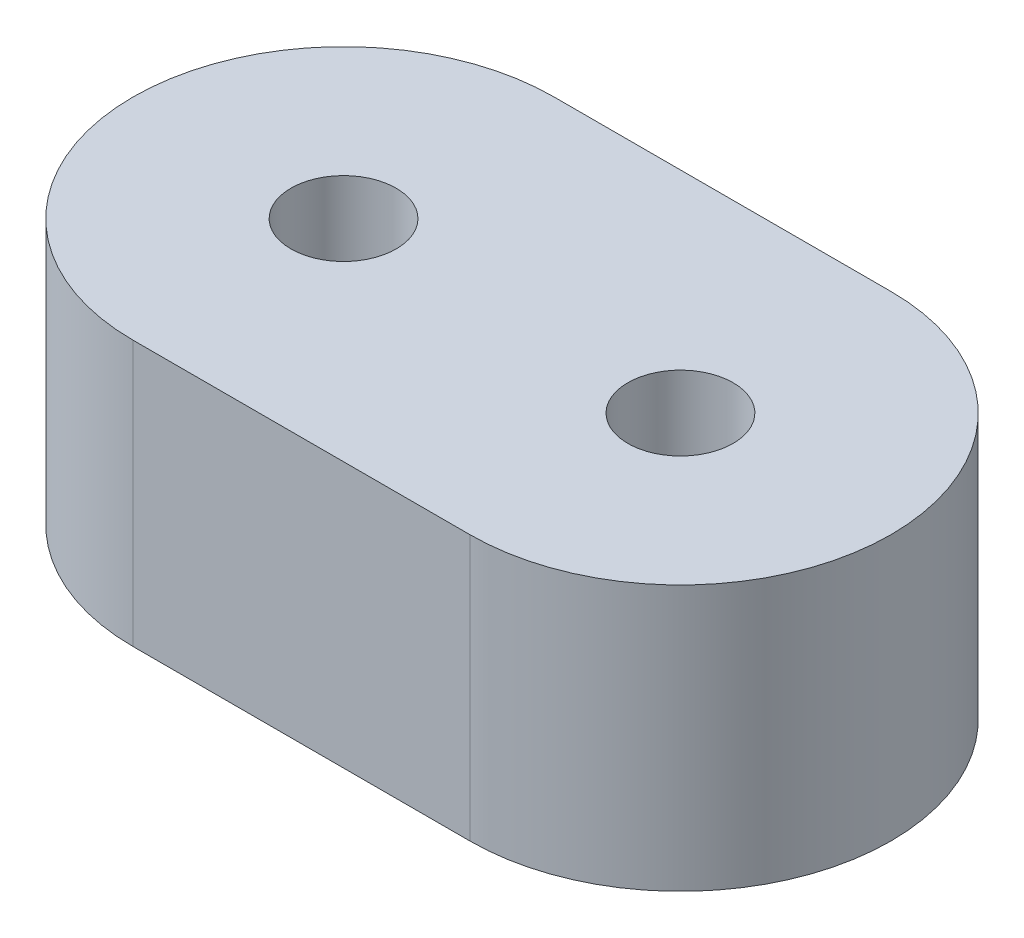
ISO-10303-21;
HEADER;
FILE_DESCRIPTION(('STEP AP214'),'2;1');
FILE_NAME('part.step','',(''),(''),'','','');
FILE_SCHEMA(('AUTOMOTIVE_DESIGN { 1 0 10303 214 1 1 1 1 }'));
ENDSEC;
DATA;
#1=APPLICATION_CONTEXT('core data for automotive mechanical design processes');
#2=APPLICATION_PROTOCOL_DEFINITION('international standard','automotive_design',2000,#1);
#3=PRODUCT_CONTEXT('',#1,'mechanical');
#4=PRODUCT('Part','Part','',(#3));
#5=PRODUCT_RELATED_PRODUCT_CATEGORY('part','',(#4));
#6=PRODUCT_DEFINITION_FORMATION('','',#4);
#7=PRODUCT_DEFINITION_CONTEXT('part definition',#1,'design');
#8=PRODUCT_DEFINITION('design','',#6,#7);
#9=PRODUCT_DEFINITION_SHAPE('','',#8);
#10=(LENGTH_UNIT() NAMED_UNIT(*) SI_UNIT(.MILLI.,.METRE.));
#11=(NAMED_UNIT(*) PLANE_ANGLE_UNIT() SI_UNIT($,.RADIAN.));
#12=(NAMED_UNIT(*) SI_UNIT($,.STERADIAN.) SOLID_ANGLE_UNIT());
#13=UNCERTAINTY_MEASURE_WITH_UNIT(LENGTH_MEASURE(1.E-05),#10,'distance_accuracy_value','');
#14=(GEOMETRIC_REPRESENTATION_CONTEXT(3) GLOBAL_UNCERTAINTY_ASSIGNED_CONTEXT((#13)) GLOBAL_UNIT_ASSIGNED_CONTEXT((#10,
#11,#12)) REPRESENTATION_CONTEXT('',''));
#15=CARTESIAN_POINT('',(0.,0.,0.));
#16=DIRECTION('',(0.,0.,1.));
#17=DIRECTION('',(1.,0.,0.));
#18=AXIS2_PLACEMENT_3D('',#15,#16,#17);
#19=CARTESIAN_POINT('',(0.,6.3,0.));
#20=DIRECTION('',(0.,1.,0.));
#21=DIRECTION('',(0.,0.,1.));
#22=AXIS2_PLACEMENT_3D('',#19,#20,#21);
#23=PLANE('',#22);
#24=CARTESIAN_POINT('',(0.,6.3,0.));
#25=DIRECTION('',(0.,1.,0.));
#26=DIRECTION('',(0.,0.,1.));
#27=AXIS2_PLACEMENT_3D('',#24,#25,#26);
#28=CIRCLE('',#27,1.25);
#29=CARTESIAN_POINT('',(0.,6.3,1.25));
#30=VERTEX_POINT('',#29);
#31=EDGE_CURVE('E112',#30,#30,#28,.T.);
#32=ORIENTED_EDGE('',*,*,#31,.F.);
#33=EDGE_LOOP('',(#32));
#34=FACE_BOUND('',#33,.T.);
#35=CARTESIAN_POINT('',(0.,6.3,0.));
#36=DIRECTION('',(0.,1.,0.));
#37=DIRECTION('',(0.,0.,1.));
#38=AXIS2_PLACEMENT_3D('',#35,#36,#37);
#39=CIRCLE('',#38,5.);
#40=CARTESIAN_POINT('',(0.,6.3,-5.));
#41=VERTEX_POINT('',#40);
#42=CARTESIAN_POINT('',(0.,6.3,5.));
#43=VERTEX_POINT('',#42);
#44=EDGE_CURVE('E92',#41,#43,#39,.T.);
#45=ORIENTED_EDGE('',*,*,#44,.T.);
#46=DIRECTION('',(1.,0.,0.));
#47=VECTOR('',#46,1.);
#48=CARTESIAN_POINT('',(8.,6.3,5.));
#49=LINE('',#48,#47);
#50=CARTESIAN_POINT('',(8.,6.3,5.));
#51=VERTEX_POINT('',#50);
#52=EDGE_CURVE('E87',#43,#51,#49,.T.);
#53=ORIENTED_EDGE('',*,*,#52,.T.);
#54=CARTESIAN_POINT('',(8.,6.3,0.));
#55=DIRECTION('',(0.,1.,0.));
#56=DIRECTION('',(0.,0.,-1.));
#57=AXIS2_PLACEMENT_3D('',#54,#55,#56);
#58=CIRCLE('',#57,5.);
#59=CARTESIAN_POINT('',(8.,6.3,-5.));
#60=VERTEX_POINT('',#59);
#61=EDGE_CURVE('E90',#51,#60,#58,.T.);
#62=ORIENTED_EDGE('',*,*,#61,.T.);
#63=DIRECTION('',(-1.,0.,0.));
#64=VECTOR('',#63,1.);
#65=CARTESIAN_POINT('',(0.,6.3,-5.));
#66=LINE('',#65,#64);
#67=EDGE_CURVE('E57',#60,#41,#66,.T.);
#68=ORIENTED_EDGE('',*,*,#67,.T.);
#69=EDGE_LOOP('',(#45,#53,#62,#68));
#70=FACE_BOUND('',#69,.T.);
#71=CARTESIAN_POINT('',(8.,6.3,0.));
#72=DIRECTION('',(0.,1.,0.));
#73=DIRECTION('',(0.,0.,-1.));
#74=AXIS2_PLACEMENT_3D('',#71,#72,#73);
#75=CIRCLE('',#74,1.25);
#76=CARTESIAN_POINT('',(8.,6.3,-1.25));
#77=VERTEX_POINT('',#76);
#78=EDGE_CURVE('E134',#77,#77,#75,.T.);
#79=ORIENTED_EDGE('',*,*,#78,.F.);
#80=EDGE_LOOP('',(#79));
#81=FACE_BOUND('',#80,.T.);
#82=ADVANCED_FACE('F39',(#34,#70,#81),#23,.T.);
#83=CARTESIAN_POINT('',(0.,0.,0.));
#84=DIRECTION('',(0.,1.,0.));
#85=DIRECTION('',(0.,0.,1.));
#86=AXIS2_PLACEMENT_3D('',#83,#84,#85);
#87=PLANE('',#86);
#88=CARTESIAN_POINT('',(0.,0.,0.));
#89=DIRECTION('',(0.,1.,0.));
#90=DIRECTION('',(0.,0.,1.));
#91=AXIS2_PLACEMENT_3D('',#88,#89,#90);
#92=CIRCLE('',#91,5.);
#93=CARTESIAN_POINT('',(0.,0.,-5.));
#94=VERTEX_POINT('',#93);
#95=CARTESIAN_POINT('',(0.,0.,5.));
#96=VERTEX_POINT('',#95);
#97=EDGE_CURVE('E108',#94,#96,#92,.T.);
#98=ORIENTED_EDGE('',*,*,#97,.F.);
#99=DIRECTION('',(-1.,0.,0.));
#100=VECTOR('',#99,1.);
#101=CARTESIAN_POINT('',(0.,0.,-5.));
#102=LINE('',#101,#100);
#103=CARTESIAN_POINT('',(8.,0.,-5.));
#104=VERTEX_POINT('',#103);
#105=EDGE_CURVE('E80',#104,#94,#102,.T.);
#106=ORIENTED_EDGE('',*,*,#105,.F.);
#107=CARTESIAN_POINT('',(8.,0.,0.));
#108=DIRECTION('',(0.,1.,0.));
#109=DIRECTION('',(0.,0.,-1.));
#110=AXIS2_PLACEMENT_3D('',#107,#108,#109);
#111=CIRCLE('',#110,5.);
#112=CARTESIAN_POINT('',(8.,0.,5.));
#113=VERTEX_POINT('',#112);
#114=EDGE_CURVE('E74',#113,#104,#111,.T.);
#115=ORIENTED_EDGE('',*,*,#114,.F.);
#116=DIRECTION('',(1.,0.,0.));
#117=VECTOR('',#116,1.);
#118=CARTESIAN_POINT('',(8.,0.,5.));
#119=LINE('',#118,#117);
#120=EDGE_CURVE('E97',#96,#113,#119,.T.);
#121=ORIENTED_EDGE('',*,*,#120,.F.);
#122=EDGE_LOOP('',(#98,#106,#115,#121));
#123=FACE_BOUND('',#122,.T.);
#124=CARTESIAN_POINT('',(0.,0.,0.));
#125=DIRECTION('',(0.,1.,0.));
#126=DIRECTION('',(0.,0.,1.));
#127=AXIS2_PLACEMENT_3D('',#124,#125,#126);
#128=CIRCLE('',#127,1.25);
#129=CARTESIAN_POINT('',(0.,0.,1.25));
#130=VERTEX_POINT('',#129);
#131=EDGE_CURVE('E130',#130,#130,#128,.T.);
#132=ORIENTED_EDGE('',*,*,#131,.T.);
#133=EDGE_LOOP('',(#132));
#134=FACE_BOUND('',#133,.T.);
#135=CARTESIAN_POINT('',(8.,0.,0.));
#136=DIRECTION('',(0.,1.,0.));
#137=DIRECTION('',(0.,0.,-1.));
#138=AXIS2_PLACEMENT_3D('',#135,#136,#137);
#139=CIRCLE('',#138,1.25);
#140=CARTESIAN_POINT('',(8.,0.,-1.25));
#141=VERTEX_POINT('',#140);
#142=EDGE_CURVE('E138',#141,#141,#139,.T.);
#143=ORIENTED_EDGE('',*,*,#142,.T.);
#144=EDGE_LOOP('',(#143));
#145=FACE_BOUND('',#144,.T.);
#146=ADVANCED_FACE('F125',(#123,#134,#145),#87,.F.);
#147=CARTESIAN_POINT('',(0.,6.3,0.));
#148=DIRECTION('',(0.,-1.,0.));
#149=DIRECTION('',(0.,0.,-1.));
#150=AXIS2_PLACEMENT_3D('',#147,#148,#149);
#151=CYLINDRICAL_SURFACE('',#150,5.);
#152=ORIENTED_EDGE('',*,*,#97,.T.);
#153=DIRECTION('',(0.,-1.,0.));
#154=VECTOR('',#153,1.);
#155=CARTESIAN_POINT('',(0.,6.3,5.));
#156=LINE('',#155,#154);
#157=EDGE_CURVE('E11',#43,#96,#156,.T.);
#158=ORIENTED_EDGE('',*,*,#157,.F.);
#159=ORIENTED_EDGE('',*,*,#44,.F.);
#160=DIRECTION('',(0.,-1.,0.));
#161=VECTOR('',#160,1.);
#162=CARTESIAN_POINT('',(0.,6.3,-5.));
#163=LINE('',#162,#161);
#164=EDGE_CURVE('E104',#41,#94,#163,.T.);
#165=ORIENTED_EDGE('',*,*,#164,.T.);
#166=EDGE_LOOP('',(#152,#158,#159,#165));
#167=FACE_BOUND('',#166,.T.);
#168=ADVANCED_FACE('F41',(#167),#151,.T.);
#169=CARTESIAN_POINT('',(8.,6.3,5.));
#170=DIRECTION('',(0.,0.,-1.));
#171=DIRECTION('',(-1.,0.,0.));
#172=AXIS2_PLACEMENT_3D('',#169,#170,#171);
#173=PLANE('',#172);
#174=ORIENTED_EDGE('',*,*,#120,.T.);
#175=DIRECTION('',(0.,-1.,0.));
#176=VECTOR('',#175,1.);
#177=CARTESIAN_POINT('',(8.,6.3,5.));
#178=LINE('',#177,#176);
#179=EDGE_CURVE('E49',#51,#113,#178,.T.);
#180=ORIENTED_EDGE('',*,*,#179,.F.);
#181=ORIENTED_EDGE('',*,*,#52,.F.);
#182=ORIENTED_EDGE('',*,*,#157,.T.);
#183=EDGE_LOOP('',(#174,#180,#181,#182));
#184=FACE_BOUND('',#183,.T.);
#185=ADVANCED_FACE('F96',(#184),#173,.F.);
#186=CARTESIAN_POINT('',(8.,6.3,0.));
#187=DIRECTION('',(0.,-1.,0.));
#188=DIRECTION('',(0.,0.,-1.));
#189=AXIS2_PLACEMENT_3D('',#186,#187,#188);
#190=CYLINDRICAL_SURFACE('',#189,5.);
#191=ORIENTED_EDGE('',*,*,#114,.T.);
#192=DIRECTION('',(0.,-1.,0.));
#193=VECTOR('',#192,1.);
#194=CARTESIAN_POINT('',(8.,6.3,-5.));
#195=LINE('',#194,#193);
#196=EDGE_CURVE('E99',#60,#104,#195,.T.);
#197=ORIENTED_EDGE('',*,*,#196,.F.);
#198=ORIENTED_EDGE('',*,*,#61,.F.);
#199=ORIENTED_EDGE('',*,*,#179,.T.);
#200=EDGE_LOOP('',(#191,#197,#198,#199));
#201=FACE_BOUND('',#200,.T.);
#202=ADVANCED_FACE('F100',(#201),#190,.T.);
#203=CARTESIAN_POINT('',(0.,6.3,-5.));
#204=DIRECTION('',(0.,0.,1.));
#205=DIRECTION('',(1.,0.,0.));
#206=AXIS2_PLACEMENT_3D('',#203,#204,#205);
#207=PLANE('',#206);
#208=ORIENTED_EDGE('',*,*,#105,.T.);
#209=ORIENTED_EDGE('',*,*,#164,.F.);
#210=ORIENTED_EDGE('',*,*,#67,.F.);
#211=ORIENTED_EDGE('',*,*,#196,.T.);
#212=EDGE_LOOP('',(#208,#209,#210,#211));
#213=FACE_BOUND('',#212,.T.);
#214=ADVANCED_FACE('F122',(#213),#207,.F.);
#215=CARTESIAN_POINT('',(0.,6.3,0.));
#216=DIRECTION('',(0.,-1.,0.));
#217=DIRECTION('',(0.,0.,-1.));
#218=AXIS2_PLACEMENT_3D('',#215,#216,#217);
#219=CYLINDRICAL_SURFACE('',#218,1.25);
#220=ORIENTED_EDGE('',*,*,#31,.T.);
#221=EDGE_LOOP('',(#220));
#222=FACE_BOUND('',#221,.T.);
#223=ORIENTED_EDGE('',*,*,#131,.F.);
#224=EDGE_LOOP('',(#223));
#225=FACE_BOUND('',#224,.T.);
#226=ADVANCED_FACE('F157',(#222,#225),#219,.F.);
#227=CARTESIAN_POINT('',(8.,6.3,0.));
#228=DIRECTION('',(0.,-1.,0.));
#229=DIRECTION('',(0.,0.,-1.));
#230=AXIS2_PLACEMENT_3D('',#227,#228,#229);
#231=CYLINDRICAL_SURFACE('',#230,1.25);
#232=ORIENTED_EDGE('',*,*,#78,.T.);
#233=EDGE_LOOP('',(#232));
#234=FACE_BOUND('',#233,.T.);
#235=ORIENTED_EDGE('',*,*,#142,.F.);
#236=EDGE_LOOP('',(#235));
#237=FACE_BOUND('',#236,.T.);
#238=ADVANCED_FACE('F146',(#234,#237),#231,.F.);
#239=CLOSED_SHELL('',(#82,#146,#168,#185,#202,#214,#226,#238));
#240=MANIFOLD_SOLID_BREP('B2',#239);
#241=ADVANCED_BREP_SHAPE_REPRESENTATION('',(#18,#240),#14);
#242=SHAPE_DEFINITION_REPRESENTATION(#9,#241);
ENDSEC;
END-ISO-10303-21;
